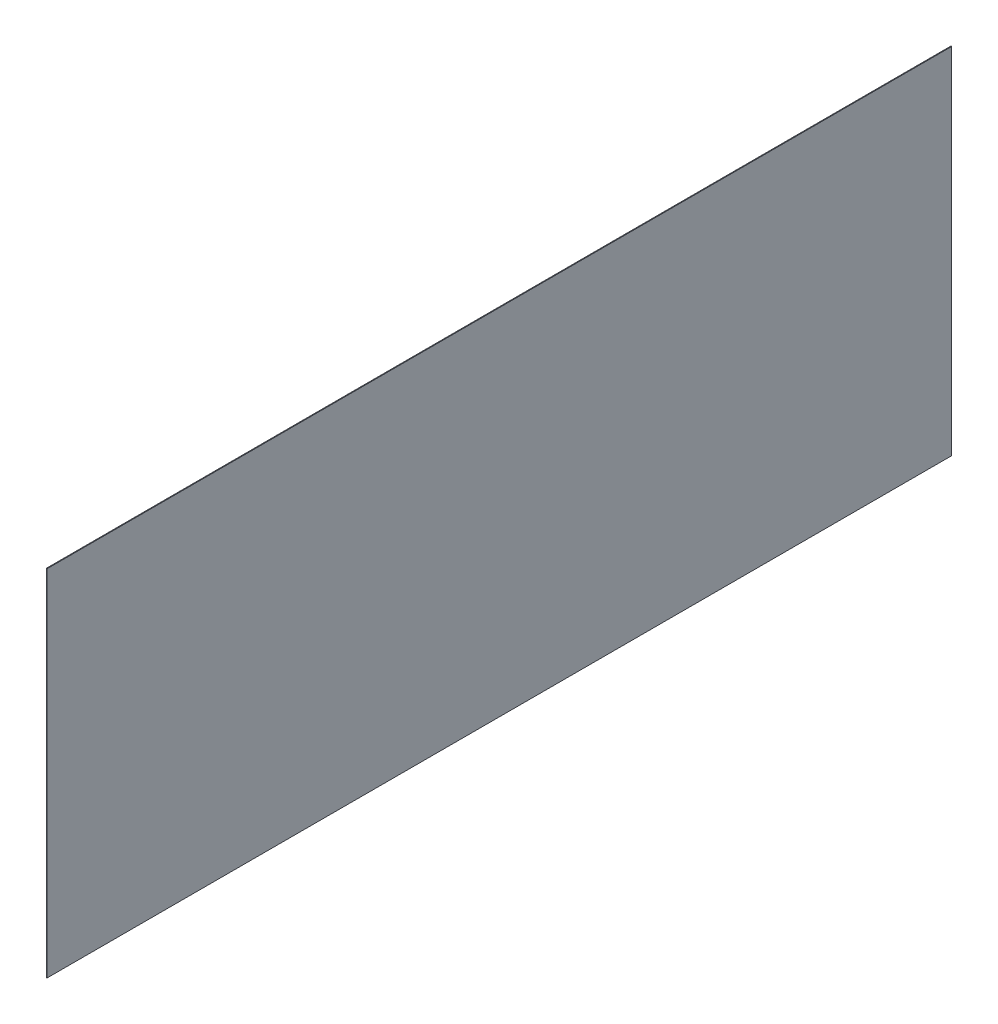
ISO-10303-21;
HEADER;
FILE_DESCRIPTION(('STEP AP214'),'2;1');
FILE_NAME('part.step','',(''),(''),'','','');
FILE_SCHEMA(('AUTOMOTIVE_DESIGN { 1 0 10303 214 1 1 1 1 }'));
ENDSEC;
DATA;
#1=APPLICATION_CONTEXT('core data for automotive mechanical design processes');
#2=APPLICATION_PROTOCOL_DEFINITION('international standard','automotive_design',2000,#1);
#3=PRODUCT_CONTEXT('',#1,'mechanical');
#4=PRODUCT('Part','Part','',(#3));
#5=PRODUCT_RELATED_PRODUCT_CATEGORY('part','',(#4));
#6=PRODUCT_DEFINITION_FORMATION('','',#4);
#7=PRODUCT_DEFINITION_CONTEXT('part definition',#1,'design');
#8=PRODUCT_DEFINITION('design','',#6,#7);
#9=PRODUCT_DEFINITION_SHAPE('','',#8);
#10=(LENGTH_UNIT() NAMED_UNIT(*) SI_UNIT(.MILLI.,.METRE.));
#11=(NAMED_UNIT(*) PLANE_ANGLE_UNIT() SI_UNIT($,.RADIAN.));
#12=(NAMED_UNIT(*) SI_UNIT($,.STERADIAN.) SOLID_ANGLE_UNIT());
#13=UNCERTAINTY_MEASURE_WITH_UNIT(LENGTH_MEASURE(1.E-05),#10,'distance_accuracy_value','');
#14=(GEOMETRIC_REPRESENTATION_CONTEXT(3) GLOBAL_UNCERTAINTY_ASSIGNED_CONTEXT((#13)) GLOBAL_UNIT_ASSIGNED_CONTEXT((#10,
#11,#12)) REPRESENTATION_CONTEXT('',''));
#15=CARTESIAN_POINT('',(0.,0.,0.));
#16=DIRECTION('',(0.,0.,1.));
#17=DIRECTION('',(1.,0.,0.));
#18=AXIS2_PLACEMENT_3D('',#15,#16,#17);
#19=CARTESIAN_POINT('',(5.,1179.,-3009.));
#20=DIRECTION('',(0.,0.,1.));
#21=DIRECTION('',(0.,-1.,0.));
#22=AXIS2_PLACEMENT_3D('',#19,#20,#21);
#23=PLANE('',#22);
#24=DIRECTION('',(0.,1.,0.));
#25=VECTOR('',#24,1.);
#26=CARTESIAN_POINT('',(0.,1179.,-3009.));
#27=LINE('',#26,#25);
#28=CARTESIAN_POINT('',(0.,-1179.,-3009.));
#29=VERTEX_POINT('',#28);
#30=CARTESIAN_POINT('',(0.,1179.,-3009.));
#31=VERTEX_POINT('',#30);
#32=EDGE_CURVE('E109',#29,#31,#27,.T.);
#33=ORIENTED_EDGE('',*,*,#32,.T.);
#34=DIRECTION('',(-1.,0.,0.));
#35=VECTOR('',#34,1.);
#36=CARTESIAN_POINT('',(5.,1179.,-3009.));
#37=LINE('',#36,#35);
#38=CARTESIAN_POINT('',(5.,1179.,-3009.));
#39=VERTEX_POINT('',#38);
#40=EDGE_CURVE('E11',#39,#31,#37,.T.);
#41=ORIENTED_EDGE('',*,*,#40,.F.);
#42=DIRECTION('',(0.,1.,0.));
#43=VECTOR('',#42,1.);
#44=CARTESIAN_POINT('',(5.,1179.,-3009.));
#45=LINE('',#44,#43);
#46=CARTESIAN_POINT('',(5.,-1179.,-3009.));
#47=VERTEX_POINT('',#46);
#48=EDGE_CURVE('E93',#47,#39,#45,.T.);
#49=ORIENTED_EDGE('',*,*,#48,.F.);
#50=DIRECTION('',(-1.,0.,0.));
#51=VECTOR('',#50,1.);
#52=CARTESIAN_POINT('',(5.,-1179.,-3009.));
#53=LINE('',#52,#51);
#54=EDGE_CURVE('E105',#47,#29,#53,.T.);
#55=ORIENTED_EDGE('',*,*,#54,.T.);
#56=EDGE_LOOP('',(#33,#41,#49,#55));
#57=FACE_BOUND('',#56,.T.);
#58=ADVANCED_FACE('F41',(#57),#23,.F.);
#59=CARTESIAN_POINT('',(5.,1179.,3009.));
#60=DIRECTION('',(0.,-1.,0.));
#61=DIRECTION('',(0.,0.,-1.));
#62=AXIS2_PLACEMENT_3D('',#59,#60,#61);
#63=PLANE('',#62);
#64=DIRECTION('',(0.,0.,1.));
#65=VECTOR('',#64,1.);
#66=CARTESIAN_POINT('',(0.,1179.,3009.));
#67=LINE('',#66,#65);
#68=CARTESIAN_POINT('',(0.,1179.,3009.));
#69=VERTEX_POINT('',#68);
#70=EDGE_CURVE('E98',#31,#69,#67,.T.);
#71=ORIENTED_EDGE('',*,*,#70,.T.);
#72=DIRECTION('',(-1.,0.,0.));
#73=VECTOR('',#72,1.);
#74=CARTESIAN_POINT('',(5.,1179.,3009.));
#75=LINE('',#74,#73);
#76=CARTESIAN_POINT('',(5.,1179.,3009.));
#77=VERTEX_POINT('',#76);
#78=EDGE_CURVE('E50',#77,#69,#75,.T.);
#79=ORIENTED_EDGE('',*,*,#78,.F.);
#80=DIRECTION('',(0.,0.,1.));
#81=VECTOR('',#80,1.);
#82=CARTESIAN_POINT('',(5.,1179.,3009.));
#83=LINE('',#82,#81);
#84=EDGE_CURVE('E88',#39,#77,#83,.T.);
#85=ORIENTED_EDGE('',*,*,#84,.F.);
#86=ORIENTED_EDGE('',*,*,#40,.T.);
#87=EDGE_LOOP('',(#71,#79,#85,#86));
#88=FACE_BOUND('',#87,.T.);
#89=ADVANCED_FACE('F97',(#88),#63,.F.);
#90=CARTESIAN_POINT('',(5.,1179.,3009.));
#91=DIRECTION('',(0.,0.,-1.));
#92=DIRECTION('',(0.,1.,0.));
#93=AXIS2_PLACEMENT_3D('',#90,#91,#92);
#94=PLANE('',#93);
#95=DIRECTION('',(0.,-1.,0.));
#96=VECTOR('',#95,1.);
#97=CARTESIAN_POINT('',(0.,1179.,3009.));
#98=LINE('',#97,#96);
#99=CARTESIAN_POINT('',(0.,-1179.,3009.));
#100=VERTEX_POINT('',#99);
#101=EDGE_CURVE('E75',#69,#100,#98,.T.);
#102=ORIENTED_EDGE('',*,*,#101,.T.);
#103=DIRECTION('',(-1.,0.,0.));
#104=VECTOR('',#103,1.);
#105=CARTESIAN_POINT('',(5.,-1179.,3009.));
#106=LINE('',#105,#104);
#107=CARTESIAN_POINT('',(5.,-1179.,3009.));
#108=VERTEX_POINT('',#107);
#109=EDGE_CURVE('E100',#108,#100,#106,.T.);
#110=ORIENTED_EDGE('',*,*,#109,.F.);
#111=DIRECTION('',(0.,-1.,0.));
#112=VECTOR('',#111,1.);
#113=CARTESIAN_POINT('',(5.,1179.,3009.));
#114=LINE('',#113,#112);
#115=EDGE_CURVE('E91',#77,#108,#114,.T.);
#116=ORIENTED_EDGE('',*,*,#115,.F.);
#117=ORIENTED_EDGE('',*,*,#78,.T.);
#118=EDGE_LOOP('',(#102,#110,#116,#117));
#119=FACE_BOUND('',#118,.T.);
#120=ADVANCED_FACE('F101',(#119),#94,.F.);
#121=CARTESIAN_POINT('',(5.,-1179.,3009.));
#122=DIRECTION('',(0.,1.,0.));
#123=DIRECTION('',(0.,0.,1.));
#124=AXIS2_PLACEMENT_3D('',#121,#122,#123);
#125=PLANE('',#124);
#126=DIRECTION('',(0.,0.,-1.));
#127=VECTOR('',#126,1.);
#128=CARTESIAN_POINT('',(0.,-1179.,3009.));
#129=LINE('',#128,#127);
#130=EDGE_CURVE('E81',#100,#29,#129,.T.);
#131=ORIENTED_EDGE('',*,*,#130,.T.);
#132=ORIENTED_EDGE('',*,*,#54,.F.);
#133=DIRECTION('',(0.,0.,-1.));
#134=VECTOR('',#133,1.);
#135=CARTESIAN_POINT('',(5.,-1179.,3009.));
#136=LINE('',#135,#134);
#137=EDGE_CURVE('E58',#108,#47,#136,.T.);
#138=ORIENTED_EDGE('',*,*,#137,.F.);
#139=ORIENTED_EDGE('',*,*,#109,.T.);
#140=EDGE_LOOP('',(#131,#132,#138,#139));
#141=FACE_BOUND('',#140,.T.);
#142=ADVANCED_FACE('F122',(#141),#125,.F.);
#143=CARTESIAN_POINT('',(5.,0.,0.));
#144=DIRECTION('',(1.,0.,0.));
#145=DIRECTION('',(0.,0.,-1.));
#146=AXIS2_PLACEMENT_3D('',#143,#144,#145);
#147=PLANE('',#146);
#148=ORIENTED_EDGE('',*,*,#48,.T.);
#149=ORIENTED_EDGE('',*,*,#84,.T.);
#150=ORIENTED_EDGE('',*,*,#115,.T.);
#151=ORIENTED_EDGE('',*,*,#137,.T.);
#152=EDGE_LOOP('',(#148,#149,#150,#151));
#153=FACE_BOUND('',#152,.T.);
#154=ADVANCED_FACE('F89',(#153),#147,.T.);
#155=CARTESIAN_POINT('',(0.,0.,0.));
#156=DIRECTION('',(1.,0.,0.));
#157=DIRECTION('',(0.,0.,-1.));
#158=AXIS2_PLACEMENT_3D('',#155,#156,#157);
#159=PLANE('',#158);
#160=ORIENTED_EDGE('',*,*,#32,.F.);
#161=ORIENTED_EDGE('',*,*,#130,.F.);
#162=ORIENTED_EDGE('',*,*,#101,.F.);
#163=ORIENTED_EDGE('',*,*,#70,.F.);
#164=EDGE_LOOP('',(#160,#161,#162,#163));
#165=FACE_BOUND('',#164,.T.);
#166=ADVANCED_FACE('F125',(#165),#159,.F.);
#167=CLOSED_SHELL('',(#58,#89,#120,#142,#154,#166));
#168=MANIFOLD_SOLID_BREP('B2',#167);
#169=ADVANCED_BREP_SHAPE_REPRESENTATION('',(#18,#168),#14);
#170=SHAPE_DEFINITION_REPRESENTATION(#9,#169);
ENDSEC;
END-ISO-10303-21;
